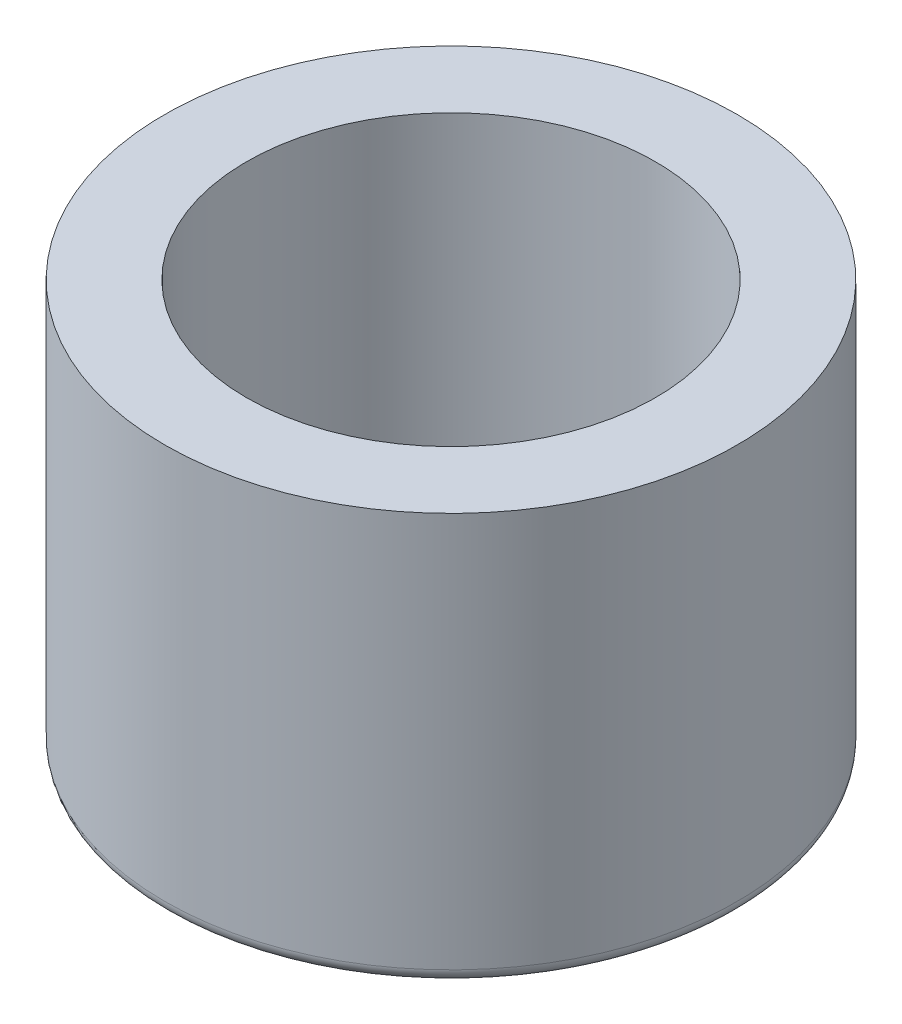
ISO-10303-21;
HEADER;
FILE_DESCRIPTION(('STEP AP214'),'2;1');
FILE_NAME('part.step','',(''),(''),'','','');
FILE_SCHEMA(('AUTOMOTIVE_DESIGN { 1 0 10303 214 1 1 1 1 }'));
ENDSEC;
DATA;
#1=APPLICATION_CONTEXT('core data for automotive mechanical design processes');
#2=APPLICATION_PROTOCOL_DEFINITION('international standard','automotive_design',2000,#1);
#3=PRODUCT_CONTEXT('',#1,'mechanical');
#4=PRODUCT('Part','Part','',(#3));
#5=PRODUCT_RELATED_PRODUCT_CATEGORY('part','',(#4));
#6=PRODUCT_DEFINITION_FORMATION('','',#4);
#7=PRODUCT_DEFINITION_CONTEXT('part definition',#1,'design');
#8=PRODUCT_DEFINITION('design','',#6,#7);
#9=PRODUCT_DEFINITION_SHAPE('','',#8);
#10=(LENGTH_UNIT() NAMED_UNIT(*) SI_UNIT(.MILLI.,.METRE.));
#11=(NAMED_UNIT(*) PLANE_ANGLE_UNIT() SI_UNIT($,.RADIAN.));
#12=(NAMED_UNIT(*) SI_UNIT($,.STERADIAN.) SOLID_ANGLE_UNIT());
#13=UNCERTAINTY_MEASURE_WITH_UNIT(LENGTH_MEASURE(1.E-05),#10,'distance_accuracy_value','');
#14=(GEOMETRIC_REPRESENTATION_CONTEXT(3) GLOBAL_UNCERTAINTY_ASSIGNED_CONTEXT((#13)) GLOBAL_UNIT_ASSIGNED_CONTEXT((#10,
#11,#12)) REPRESENTATION_CONTEXT('',''));
#15=CARTESIAN_POINT('',(0.,0.,0.));
#16=DIRECTION('',(0.,0.,1.));
#17=DIRECTION('',(1.,0.,0.));
#18=AXIS2_PLACEMENT_3D('',#15,#16,#17);
#19=CARTESIAN_POINT('',(0.,15.,0.));
#20=DIRECTION('',(0.,-1.,0.));
#21=DIRECTION('',(0.,0.,-1.));
#22=AXIS2_PLACEMENT_3D('',#19,#20,#21);
#23=CYLINDRICAL_SURFACE('',#22,10.5);
#24=CARTESIAN_POINT('',(0.,0.5,0.));
#25=DIRECTION('',(0.,1.,0.));
#26=DIRECTION('',(0.,0.,1.));
#27=AXIS2_PLACEMENT_3D('',#24,#25,#26);
#28=CIRCLE('',#27,10.5);
#29=CARTESIAN_POINT('',(0.,0.5,10.5));
#30=VERTEX_POINT('',#29);
#31=EDGE_CURVE('E38',#30,#30,#28,.T.);
#32=ORIENTED_EDGE('',*,*,#31,.T.);
#33=EDGE_LOOP('',(#32));
#34=FACE_BOUND('',#33,.T.);
#35=CARTESIAN_POINT('',(0.,15.,0.));
#36=DIRECTION('',(0.,1.,0.));
#37=DIRECTION('',(0.,0.,1.));
#38=AXIS2_PLACEMENT_3D('',#35,#36,#37);
#39=CIRCLE('',#38,10.5);
#40=CARTESIAN_POINT('',(0.,15.,10.5));
#41=VERTEX_POINT('',#40);
#42=EDGE_CURVE('E42',#41,#41,#39,.T.);
#43=ORIENTED_EDGE('',*,*,#42,.F.);
#44=EDGE_LOOP('',(#43));
#45=FACE_BOUND('',#44,.T.);
#46=ADVANCED_FACE('F31',(#34,#45),#23,.T.);
#47=CARTESIAN_POINT('',(0.,15.,0.));
#48=DIRECTION('',(0.,1.,0.));
#49=DIRECTION('',(0.,0.,1.));
#50=AXIS2_PLACEMENT_3D('',#47,#48,#49);
#51=PLANE('',#50);
#52=CARTESIAN_POINT('',(0.,15.,0.));
#53=DIRECTION('',(0.,1.,0.));
#54=DIRECTION('',(0.,0.,1.));
#55=AXIS2_PLACEMENT_3D('',#52,#53,#54);
#56=CIRCLE('',#55,7.5);
#57=CARTESIAN_POINT('',(0.,15.,7.5));
#58=VERTEX_POINT('',#57);
#59=EDGE_CURVE('E51',#58,#58,#56,.T.);
#60=ORIENTED_EDGE('',*,*,#59,.F.);
#61=EDGE_LOOP('',(#60));
#62=FACE_BOUND('',#61,.T.);
#63=ORIENTED_EDGE('',*,*,#42,.T.);
#64=EDGE_LOOP('',(#63));
#65=FACE_BOUND('',#64,.T.);
#66=ADVANCED_FACE('F57',(#62,#65),#51,.T.);
#67=CARTESIAN_POINT('',(0.,0.,0.));
#68=DIRECTION('',(0.,1.,0.));
#69=DIRECTION('',(0.,0.,1.));
#70=AXIS2_PLACEMENT_3D('',#67,#68,#69);
#71=PLANE('',#70);
#72=CARTESIAN_POINT('',(0.,0.,0.));
#73=DIRECTION('',(0.,1.,0.));
#74=DIRECTION('',(0.,0.,1.));
#75=AXIS2_PLACEMENT_3D('',#72,#73,#74);
#76=CIRCLE('',#75,10.);
#77=CARTESIAN_POINT('',(0.,0.,10.));
#78=VERTEX_POINT('',#77);
#79=EDGE_CURVE('E10',#78,#78,#76,.F.);
#80=ORIENTED_EDGE('',*,*,#79,.T.);
#81=EDGE_LOOP('',(#80));
#82=FACE_BOUND('',#81,.T.);
#83=CARTESIAN_POINT('',(0.,0.,0.));
#84=DIRECTION('',(0.,1.,0.));
#85=DIRECTION('',(0.,0.,1.));
#86=AXIS2_PLACEMENT_3D('',#83,#84,#85);
#87=CIRCLE('',#86,7.5);
#88=CARTESIAN_POINT('',(0.,0.,7.5));
#89=VERTEX_POINT('',#88);
#90=EDGE_CURVE('E46',#89,#89,#87,.F.);
#91=ORIENTED_EDGE('',*,*,#90,.F.);
#92=EDGE_LOOP('',(#91));
#93=FACE_BOUND('',#92,.T.);
#94=ADVANCED_FACE('F60',(#82,#93),#71,.F.);
#95=CARTESIAN_POINT('',(0.,-21.2132034355964,0.));
#96=DIRECTION('',(0.,1.,0.));
#97=DIRECTION('',(0.,0.,1.));
#98=AXIS2_PLACEMENT_3D('',#95,#96,#97);
#99=CYLINDRICAL_SURFACE('',#98,7.5);
#100=ORIENTED_EDGE('',*,*,#90,.T.);
#101=EDGE_LOOP('',(#100));
#102=FACE_BOUND('',#101,.T.);
#103=ORIENTED_EDGE('',*,*,#59,.T.);
#104=EDGE_LOOP('',(#103));
#105=FACE_BOUND('',#104,.T.);
#106=ADVANCED_FACE('F55',(#102,#105),#99,.F.);
#107=CARTESIAN_POINT('',(0.,0.5,0.));
#108=DIRECTION('',(0.,1.,0.));
#109=DIRECTION('',(0.,0.,1.));
#110=AXIS2_PLACEMENT_3D('',#107,#108,#109);
#111=TOROIDAL_SURFACE('',#110,10.,0.5);
#112=ORIENTED_EDGE('',*,*,#79,.F.);
#113=EDGE_LOOP('',(#112));
#114=FACE_BOUND('',#113,.T.);
#115=ORIENTED_EDGE('',*,*,#31,.F.);
#116=EDGE_LOOP('',(#115));
#117=FACE_BOUND('',#116,.T.);
#118=ADVANCED_FACE('F33',(#114,#117),#111,.T.);
#119=CLOSED_SHELL('',(#46,#66,#94,#106,#118));
#120=MANIFOLD_SOLID_BREP('B2',#119);
#121=ADVANCED_BREP_SHAPE_REPRESENTATION('',(#18,#120),#14);
#122=SHAPE_DEFINITION_REPRESENTATION(#9,#121);
ENDSEC;
END-ISO-10303-21;
